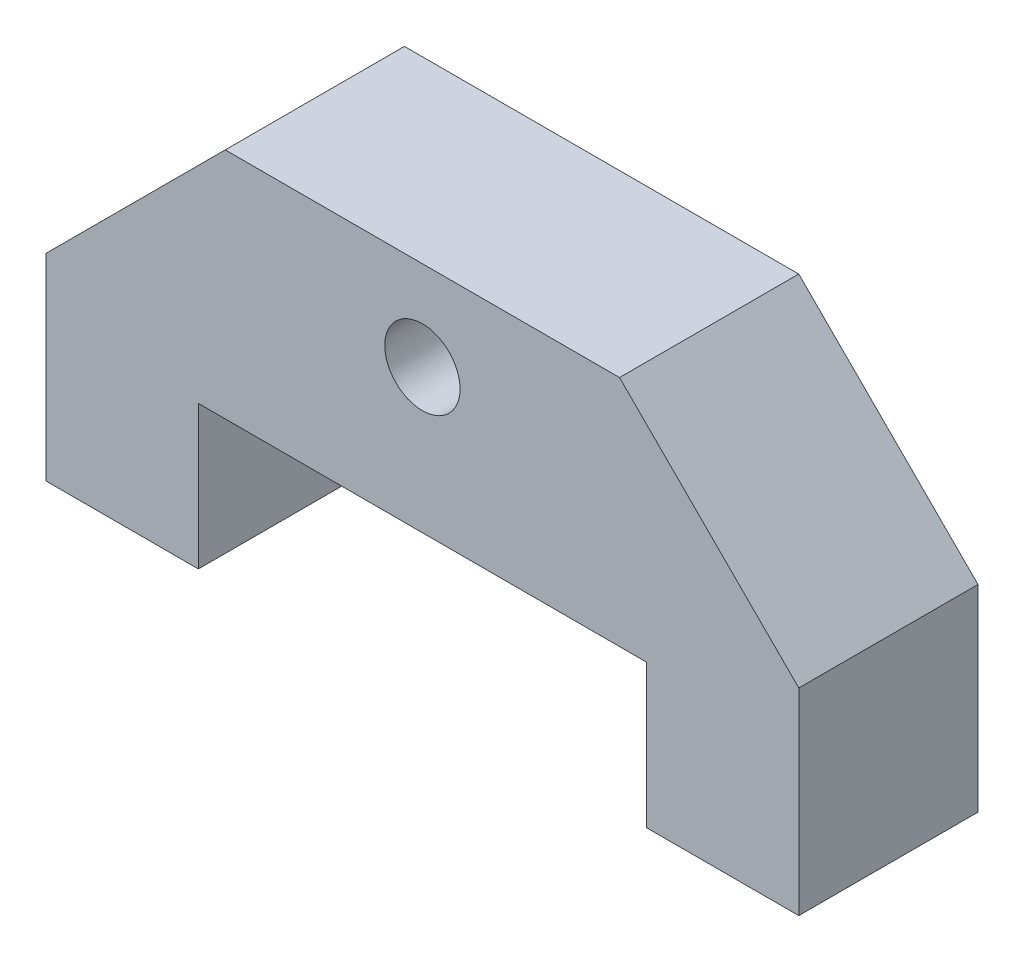
ISO-10303-21;
HEADER;
FILE_DESCRIPTION(('STEP AP214'),'2;1');
FILE_NAME('part.step','',(''),(''),'','','');
FILE_SCHEMA(('AUTOMOTIVE_DESIGN { 1 0 10303 214 1 1 1 1 }'));
ENDSEC;
DATA;
#1=APPLICATION_CONTEXT('core data for automotive mechanical design processes');
#2=APPLICATION_PROTOCOL_DEFINITION('international standard','automotive_design',2000,#1);
#3=PRODUCT_CONTEXT('',#1,'mechanical');
#4=PRODUCT('Part','Part','',(#3));
#5=PRODUCT_RELATED_PRODUCT_CATEGORY('part','',(#4));
#6=PRODUCT_DEFINITION_FORMATION('','',#4);
#7=PRODUCT_DEFINITION_CONTEXT('part definition',#1,'design');
#8=PRODUCT_DEFINITION('design','',#6,#7);
#9=PRODUCT_DEFINITION_SHAPE('','',#8);
#10=(LENGTH_UNIT() NAMED_UNIT(*) SI_UNIT(.MILLI.,.METRE.));
#11=(NAMED_UNIT(*) PLANE_ANGLE_UNIT() SI_UNIT($,.RADIAN.));
#12=(NAMED_UNIT(*) SI_UNIT($,.STERADIAN.) SOLID_ANGLE_UNIT());
#13=UNCERTAINTY_MEASURE_WITH_UNIT(LENGTH_MEASURE(1.E-05),#10,'distance_accuracy_value','');
#14=(GEOMETRIC_REPRESENTATION_CONTEXT(3) GLOBAL_UNCERTAINTY_ASSIGNED_CONTEXT((#13)) GLOBAL_UNIT_ASSIGNED_CONTEXT((#10,
#11,#12)) REPRESENTATION_CONTEXT('',''));
#15=CARTESIAN_POINT('',(0.,0.,0.));
#16=DIRECTION('',(0.,0.,1.));
#17=DIRECTION('',(1.,0.,0.));
#18=AXIS2_PLACEMENT_3D('',#15,#16,#17);
#19=CARTESIAN_POINT('',(-21.,-10.5,5.));
#20=DIRECTION('',(0.,1.,0.));
#21=DIRECTION('',(0.,0.,1.));
#22=AXIS2_PLACEMENT_3D('',#19,#20,#21);
#23=PLANE('',#22);
#24=CARTESIAN_POINT('',(16.,-10.5,0.));
#25=DIRECTION('',(0.,-1.,0.));
#26=DIRECTION('',(0.,0.,-1.));
#27=AXIS2_PLACEMENT_3D('',#24,#25,#26);
#28=CIRCLE('',#27,1.64999999999999);
#29=CARTESIAN_POINT('',(16.,-10.5,-1.64999999999999));
#30=VERTEX_POINT('',#29);
#31=EDGE_CURVE('E133',#30,#30,#28,.T.);
#32=ORIENTED_EDGE('',*,*,#31,.F.);
#33=EDGE_LOOP('',(#32));
#34=FACE_BOUND('',#33,.T.);
#35=DIRECTION('',(1.,0.,0.));
#36=VECTOR('',#35,1.);
#37=CARTESIAN_POINT('',(-21.,-10.5,5.));
#38=LINE('',#37,#36);
#39=CARTESIAN_POINT('',(12.5,-10.5,5.));
#40=VERTEX_POINT('',#39);
#41=CARTESIAN_POINT('',(21.,-10.5,5.));
#42=VERTEX_POINT('',#41);
#43=EDGE_CURVE('E180',#40,#42,#38,.T.);
#44=ORIENTED_EDGE('',*,*,#43,.F.);
#45=DIRECTION('',(0.,0.,1.));
#46=VECTOR('',#45,1.);
#47=CARTESIAN_POINT('',(12.5,-10.5,-5.));
#48=LINE('',#47,#46);
#49=CARTESIAN_POINT('',(12.5,-10.5,-5.));
#50=VERTEX_POINT('',#49);
#51=EDGE_CURVE('E164',#50,#40,#48,.T.);
#52=ORIENTED_EDGE('',*,*,#51,.F.);
#53=DIRECTION('',(1.,0.,0.));
#54=VECTOR('',#53,1.);
#55=CARTESIAN_POINT('',(-21.,-10.5,-5.));
#56=LINE('',#55,#54);
#57=CARTESIAN_POINT('',(21.,-10.5,-5.));
#58=VERTEX_POINT('',#57);
#59=EDGE_CURVE('E191',#50,#58,#56,.T.);
#60=ORIENTED_EDGE('',*,*,#59,.T.);
#61=DIRECTION('',(0.,0.,-1.));
#62=VECTOR('',#61,1.);
#63=CARTESIAN_POINT('',(21.,-10.5,5.));
#64=LINE('',#63,#62);
#65=EDGE_CURVE('E184',#42,#58,#64,.T.);
#66=ORIENTED_EDGE('',*,*,#65,.F.);
#67=EDGE_LOOP('',(#44,#52,#60,#66));
#68=FACE_BOUND('',#67,.T.);
#69=ADVANCED_FACE('F39',(#34,#68),#23,.F.);
#70=CARTESIAN_POINT('',(21.,-10.5,5.));
#71=DIRECTION('',(-1.,0.,0.));
#72=DIRECTION('',(0.,0.,1.));
#73=AXIS2_PLACEMENT_3D('',#70,#71,#72);
#74=PLANE('',#73);
#75=DIRECTION('',(0.,1.,0.));
#76=VECTOR('',#75,1.);
#77=CARTESIAN_POINT('',(21.,-10.5,-5.));
#78=LINE('',#77,#76);
#79=CARTESIAN_POINT('',(21.,0.499999999999966,-5.));
#80=VERTEX_POINT('',#79);
#81=EDGE_CURVE('E166',#58,#80,#78,.T.);
#82=ORIENTED_EDGE('',*,*,#81,.T.);
#83=DIRECTION('',(0.,0.,1.));
#84=VECTOR('',#83,1.);
#85=CARTESIAN_POINT('',(21.,0.499999999999969,5.));
#86=LINE('',#85,#84);
#87=CARTESIAN_POINT('',(21.,0.499999999999963,5.));
#88=VERTEX_POINT('',#87);
#89=EDGE_CURVE('E62',#80,#88,#86,.T.);
#90=ORIENTED_EDGE('',*,*,#89,.T.);
#91=DIRECTION('',(0.,1.,0.));
#92=VECTOR('',#91,1.);
#93=CARTESIAN_POINT('',(21.,-10.5,5.));
#94=LINE('',#93,#92);
#95=EDGE_CURVE('E173',#42,#88,#94,.T.);
#96=ORIENTED_EDGE('',*,*,#95,.F.);
#97=ORIENTED_EDGE('',*,*,#65,.T.);
#98=EDGE_LOOP('',(#82,#90,#96,#97));
#99=FACE_BOUND('',#98,.T.);
#100=ADVANCED_FACE('F223',(#99),#74,.F.);
#101=CARTESIAN_POINT('',(-21.,10.5,5.));
#102=DIRECTION('',(0.,-1.,0.));
#103=DIRECTION('',(0.,0.,-1.));
#104=AXIS2_PLACEMENT_3D('',#101,#102,#103);
#105=PLANE('',#104);
#106=DIRECTION('',(-1.,0.,0.));
#107=VECTOR('',#106,1.);
#108=CARTESIAN_POINT('',(-21.,10.5,5.));
#109=LINE('',#108,#107);
#110=CARTESIAN_POINT('',(11.,10.5,5.));
#111=VERTEX_POINT('',#110);
#112=CARTESIAN_POINT('',(-11.,10.5,5.));
#113=VERTEX_POINT('',#112);
#114=EDGE_CURVE('E175',#111,#113,#109,.T.);
#115=ORIENTED_EDGE('',*,*,#114,.F.);
#116=DIRECTION('',(0.,0.,-1.));
#117=VECTOR('',#116,1.);
#118=CARTESIAN_POINT('',(11.,10.5,5.));
#119=LINE('',#118,#117);
#120=CARTESIAN_POINT('',(11.,10.5,-5.));
#121=VERTEX_POINT('',#120);
#122=EDGE_CURVE('E201',#111,#121,#119,.T.);
#123=ORIENTED_EDGE('',*,*,#122,.T.);
#124=DIRECTION('',(-1.,0.,0.));
#125=VECTOR('',#124,1.);
#126=CARTESIAN_POINT('',(-21.,10.5,-5.));
#127=LINE('',#126,#125);
#128=CARTESIAN_POINT('',(-11.,10.5,-5.));
#129=VERTEX_POINT('',#128);
#130=EDGE_CURVE('E186',#121,#129,#127,.T.);
#131=ORIENTED_EDGE('',*,*,#130,.T.);
#132=DIRECTION('',(0.,0.,1.));
#133=VECTOR('',#132,1.);
#134=CARTESIAN_POINT('',(-11.,10.5,5.));
#135=LINE('',#134,#133);
#136=EDGE_CURVE('E199',#129,#113,#135,.T.);
#137=ORIENTED_EDGE('',*,*,#136,.T.);
#138=EDGE_LOOP('',(#115,#123,#131,#137));
#139=FACE_BOUND('',#138,.T.);
#140=ADVANCED_FACE('F215',(#139),#105,.F.);
#141=CARTESIAN_POINT('',(-21.,-10.5,5.));
#142=DIRECTION('',(1.,0.,0.));
#143=DIRECTION('',(0.,0.,-1.));
#144=AXIS2_PLACEMENT_3D('',#141,#142,#143);
#145=PLANE('',#144);
#146=DIRECTION('',(0.,-1.,0.));
#147=VECTOR('',#146,1.);
#148=CARTESIAN_POINT('',(-21.,-10.5,5.));
#149=LINE('',#148,#147);
#150=CARTESIAN_POINT('',(-21.,0.500000000000001,5.));
#151=VERTEX_POINT('',#150);
#152=CARTESIAN_POINT('',(-21.,-10.5,5.));
#153=VERTEX_POINT('',#152);
#154=EDGE_CURVE('E178',#151,#153,#149,.T.);
#155=ORIENTED_EDGE('',*,*,#154,.F.);
#156=DIRECTION('',(0.,0.,-1.));
#157=VECTOR('',#156,1.);
#158=CARTESIAN_POINT('',(-21.,0.500000000000004,5.));
#159=LINE('',#158,#157);
#160=CARTESIAN_POINT('',(-21.,0.500000000000004,-5.));
#161=VERTEX_POINT('',#160);
#162=EDGE_CURVE('E11',#151,#161,#159,.T.);
#163=ORIENTED_EDGE('',*,*,#162,.T.);
#164=DIRECTION('',(0.,-1.,0.));
#165=VECTOR('',#164,1.);
#166=CARTESIAN_POINT('',(-21.,-10.5,-5.));
#167=LINE('',#166,#165);
#168=CARTESIAN_POINT('',(-21.,-10.5,-5.));
#169=VERTEX_POINT('',#168);
#170=EDGE_CURVE('E189',#161,#169,#167,.T.);
#171=ORIENTED_EDGE('',*,*,#170,.T.);
#172=DIRECTION('',(0.,0.,-1.));
#173=VECTOR('',#172,1.);
#174=CARTESIAN_POINT('',(-21.,-10.5,5.));
#175=LINE('',#174,#173);
#176=EDGE_CURVE('E196',#153,#169,#175,.T.);
#177=ORIENTED_EDGE('',*,*,#176,.F.);
#178=EDGE_LOOP('',(#155,#163,#171,#177));
#179=FACE_BOUND('',#178,.T.);
#180=ADVANCED_FACE('F246',(#179),#145,.F.);
#181=CARTESIAN_POINT('',(-16.,-10.5,0.));
#182=DIRECTION('',(0.,-1.,0.));
#183=DIRECTION('',(0.,0.,-1.));
#184=AXIS2_PLACEMENT_3D('',#181,#182,#183);
#185=CIRCLE('',#184,1.64999999999999);
#186=CARTESIAN_POINT('',(-16.,-10.5,-1.64999999999999));
#187=VERTEX_POINT('',#186);
#188=EDGE_CURVE('E134',#187,#187,#185,.T.);
#189=ORIENTED_EDGE('',*,*,#188,.F.);
#190=EDGE_LOOP('',(#189));
#191=FACE_BOUND('',#190,.T.);
#192=CARTESIAN_POINT('',(-12.5,-10.5,-5.));
#193=VERTEX_POINT('',#192);
#194=EDGE_CURVE('E176',#169,#193,#56,.T.);
#195=ORIENTED_EDGE('',*,*,#194,.T.);
#196=DIRECTION('',(0.,0.,1.));
#197=VECTOR('',#196,1.);
#198=CARTESIAN_POINT('',(-12.5,-10.5,-5.));
#199=LINE('',#198,#197);
#200=CARTESIAN_POINT('',(-12.5,-10.5,5.));
#201=VERTEX_POINT('',#200);
#202=EDGE_CURVE('E167',#193,#201,#199,.T.);
#203=ORIENTED_EDGE('',*,*,#202,.T.);
#204=EDGE_CURVE('E181',#153,#201,#38,.T.);
#205=ORIENTED_EDGE('',*,*,#204,.F.);
#206=ORIENTED_EDGE('',*,*,#176,.T.);
#207=EDGE_LOOP('',(#195,#203,#205,#206));
#208=FACE_BOUND('',#207,.T.);
#209=ADVANCED_FACE('F242',(#191,#208),#23,.F.);
#210=CARTESIAN_POINT('',(0.,0.,5.));
#211=DIRECTION('',(0.,0.,-1.));
#212=DIRECTION('',(-1.,0.,0.));
#213=AXIS2_PLACEMENT_3D('',#210,#211,#212);
#214=PLANE('',#213);
#215=CARTESIAN_POINT('',(0.,5.5,5.));
#216=DIRECTION('',(0.,0.,1.));
#217=DIRECTION('',(1.,0.,0.));
#218=AXIS2_PLACEMENT_3D('',#215,#216,#217);
#219=CIRCLE('',#218,2.09999999999999);
#220=CARTESIAN_POINT('',(2.09999999999999,5.5,5.));
#221=VERTEX_POINT('',#220);
#222=EDGE_CURVE('E300',#221,#221,#219,.T.);
#223=ORIENTED_EDGE('',*,*,#222,.F.);
#224=EDGE_LOOP('',(#223));
#225=FACE_BOUND('',#224,.T.);
#226=ORIENTED_EDGE('',*,*,#95,.T.);
#227=DIRECTION('',(0.707106781186546,-0.707106781186549,0.));
#228=VECTOR('',#227,1.);
#229=CARTESIAN_POINT('',(11.,10.5,5.));
#230=LINE('',#229,#228);
#231=EDGE_CURVE('E47',#88,#111,#230,.F.);
#232=ORIENTED_EDGE('',*,*,#231,.T.);
#233=ORIENTED_EDGE('',*,*,#114,.T.);
#234=DIRECTION('',(0.707106781186549,0.707106781186546,0.));
#235=VECTOR('',#234,1.);
#236=CARTESIAN_POINT('',(-21.,0.500000000000004,5.));
#237=LINE('',#236,#235);
#238=EDGE_CURVE('E54',#113,#151,#237,.F.);
#239=ORIENTED_EDGE('',*,*,#238,.T.);
#240=ORIENTED_EDGE('',*,*,#154,.T.);
#241=ORIENTED_EDGE('',*,*,#204,.T.);
#242=DIRECTION('',(0.,-1.,0.));
#243=VECTOR('',#242,1.);
#244=CARTESIAN_POINT('',(-12.5,-2.5,5.));
#245=LINE('',#244,#243);
#246=CARTESIAN_POINT('',(-12.5,-2.5,5.));
#247=VERTEX_POINT('',#246);
#248=EDGE_CURVE('E151',#247,#201,#245,.T.);
#249=ORIENTED_EDGE('',*,*,#248,.F.);
#250=DIRECTION('',(-1.,0.,0.));
#251=VECTOR('',#250,1.);
#252=CARTESIAN_POINT('',(-12.5,-2.5,5.));
#253=LINE('',#252,#251);
#254=CARTESIAN_POINT('',(12.5,-2.5,5.));
#255=VERTEX_POINT('',#254);
#256=EDGE_CURVE('E160',#255,#247,#253,.T.);
#257=ORIENTED_EDGE('',*,*,#256,.F.);
#258=DIRECTION('',(0.,1.,0.));
#259=VECTOR('',#258,1.);
#260=CARTESIAN_POINT('',(12.5,-2.5,5.));
#261=LINE('',#260,#259);
#262=EDGE_CURVE('E146',#40,#255,#261,.T.);
#263=ORIENTED_EDGE('',*,*,#262,.F.);
#264=ORIENTED_EDGE('',*,*,#43,.T.);
#265=EDGE_LOOP('',(#226,#232,#233,#239,#240,#241,#249,#257,#263,#264));
#266=FACE_BOUND('',#265,.T.);
#267=ADVANCED_FACE('F211',(#225,#266),#214,.F.);
#268=CARTESIAN_POINT('',(0.,0.,-5.));
#269=DIRECTION('',(0.,0.,-1.));
#270=DIRECTION('',(-1.,0.,0.));
#271=AXIS2_PLACEMENT_3D('',#268,#269,#270);
#272=PLANE('',#271);
#273=CARTESIAN_POINT('',(0.,5.5,-5.));
#274=DIRECTION('',(0.,0.,1.));
#275=DIRECTION('',(1.,0.,0.));
#276=AXIS2_PLACEMENT_3D('',#273,#274,#275);
#277=CIRCLE('',#276,2.1);
#278=CARTESIAN_POINT('',(2.1,5.5,-5.));
#279=VERTEX_POINT('',#278);
#280=EDGE_CURVE('E140',#279,#279,#277,.T.);
#281=ORIENTED_EDGE('',*,*,#280,.T.);
#282=EDGE_LOOP('',(#281));
#283=FACE_BOUND('',#282,.T.);
#284=ORIENTED_EDGE('',*,*,#130,.F.);
#285=DIRECTION('',(-0.707106781186546,0.707106781186549,0.));
#286=VECTOR('',#285,1.);
#287=CARTESIAN_POINT('',(10.75,10.75,-5.));
#288=LINE('',#287,#286);
#289=EDGE_CURVE('E206',#121,#80,#288,.F.);
#290=ORIENTED_EDGE('',*,*,#289,.T.);
#291=ORIENTED_EDGE('',*,*,#81,.F.);
#292=ORIENTED_EDGE('',*,*,#59,.F.);
#293=DIRECTION('',(0.,1.,0.));
#294=VECTOR('',#293,1.);
#295=CARTESIAN_POINT('',(12.5,-2.5,-5.));
#296=LINE('',#295,#294);
#297=CARTESIAN_POINT('',(12.5,-2.5,-5.));
#298=VERTEX_POINT('',#297);
#299=EDGE_CURVE('E147',#50,#298,#296,.T.);
#300=ORIENTED_EDGE('',*,*,#299,.T.);
#301=DIRECTION('',(-1.,0.,0.));
#302=VECTOR('',#301,1.);
#303=CARTESIAN_POINT('',(-12.5,-2.5,-5.));
#304=LINE('',#303,#302);
#305=CARTESIAN_POINT('',(-12.5,-2.5,-5.));
#306=VERTEX_POINT('',#305);
#307=EDGE_CURVE('E150',#298,#306,#304,.T.);
#308=ORIENTED_EDGE('',*,*,#307,.T.);
#309=DIRECTION('',(0.,-1.,0.));
#310=VECTOR('',#309,1.);
#311=CARTESIAN_POINT('',(-12.5,-2.5,-5.));
#312=LINE('',#311,#310);
#313=EDGE_CURVE('E154',#306,#193,#312,.T.);
#314=ORIENTED_EDGE('',*,*,#313,.T.);
#315=ORIENTED_EDGE('',*,*,#194,.F.);
#316=ORIENTED_EDGE('',*,*,#170,.F.);
#317=DIRECTION('',(-0.707106781186549,-0.707106781186546,0.));
#318=VECTOR('',#317,1.);
#319=CARTESIAN_POINT('',(-10.75,10.75,-5.));
#320=LINE('',#319,#318);
#321=EDGE_CURVE('E204',#161,#129,#320,.F.);
#322=ORIENTED_EDGE('',*,*,#321,.T.);
#323=EDGE_LOOP('',(#284,#290,#291,#292,#300,#308,#314,#315,#316,#322));
#324=FACE_BOUND('',#323,.T.);
#325=ADVANCED_FACE('F221',(#283,#324),#272,.T.);
#326=CARTESIAN_POINT('',(12.5,-2.5,-5.));
#327=DIRECTION('',(1.,0.,0.));
#328=DIRECTION('',(0.,1.,0.));
#329=AXIS2_PLACEMENT_3D('',#326,#327,#328);
#330=PLANE('',#329);
#331=ORIENTED_EDGE('',*,*,#262,.T.);
#332=DIRECTION('',(0.,0.,1.));
#333=VECTOR('',#332,1.);
#334=CARTESIAN_POINT('',(12.5,-2.5,-5.));
#335=LINE('',#334,#333);
#336=EDGE_CURVE('E157',#298,#255,#335,.T.);
#337=ORIENTED_EDGE('',*,*,#336,.F.);
#338=ORIENTED_EDGE('',*,*,#299,.F.);
#339=ORIENTED_EDGE('',*,*,#51,.T.);
#340=EDGE_LOOP('',(#331,#337,#338,#339));
#341=FACE_BOUND('',#340,.T.);
#342=ADVANCED_FACE('F230',(#341),#330,.F.);
#343=CARTESIAN_POINT('',(-12.5,-2.5,-5.));
#344=DIRECTION('',(-1.,0.,0.));
#345=DIRECTION('',(0.,-1.,0.));
#346=AXIS2_PLACEMENT_3D('',#343,#344,#345);
#347=PLANE('',#346);
#348=ORIENTED_EDGE('',*,*,#248,.T.);
#349=ORIENTED_EDGE('',*,*,#202,.F.);
#350=ORIENTED_EDGE('',*,*,#313,.F.);
#351=DIRECTION('',(0.,0.,1.));
#352=VECTOR('',#351,1.);
#353=CARTESIAN_POINT('',(-12.5,-2.5,-5.));
#354=LINE('',#353,#352);
#355=EDGE_CURVE('E170',#306,#247,#354,.T.);
#356=ORIENTED_EDGE('',*,*,#355,.T.);
#357=EDGE_LOOP('',(#348,#349,#350,#356));
#358=FACE_BOUND('',#357,.T.);
#359=ADVANCED_FACE('F238',(#358),#347,.F.);
#360=CARTESIAN_POINT('',(-12.5,-2.5,-5.));
#361=DIRECTION('',(0.,1.,0.));
#362=DIRECTION('',(0.,0.,1.));
#363=AXIS2_PLACEMENT_3D('',#360,#361,#362);
#364=PLANE('',#363);
#365=ORIENTED_EDGE('',*,*,#256,.T.);
#366=ORIENTED_EDGE('',*,*,#355,.F.);
#367=ORIENTED_EDGE('',*,*,#307,.F.);
#368=ORIENTED_EDGE('',*,*,#336,.T.);
#369=EDGE_LOOP('',(#365,#366,#367,#368));
#370=FACE_BOUND('',#369,.T.);
#371=ADVANCED_FACE('F235',(#370),#364,.F.);
#372=CARTESIAN_POINT('',(16.,-0.400000000000005,0.));
#373=DIRECTION('',(0.,-1.,0.));
#374=DIRECTION('',(0.,0.,-1.));
#375=AXIS2_PLACEMENT_3D('',#372,#373,#374);
#376=CONICAL_SURFACE('',#375,1.64999999999999,1.02974425867665);
#377=CARTESIAN_POINT('',(16.,0.591420021395473,0.));
#378=VERTEX_POINT('',#377);
#379=VERTEX_LOOP('',#378);
#380=FACE_BOUND('',#379,.T.);
#381=CARTESIAN_POINT('',(16.,-0.400000000000005,0.));
#382=DIRECTION('',(0.,-1.,0.));
#383=DIRECTION('',(0.,0.,-1.));
#384=AXIS2_PLACEMENT_3D('',#381,#382,#383);
#385=CIRCLE('',#384,1.64999999999999);
#386=CARTESIAN_POINT('',(16.,-0.400000000000005,-1.64999999999998));
#387=VERTEX_POINT('',#386);
#388=EDGE_CURVE('E137',#387,#387,#385,.T.);
#389=ORIENTED_EDGE('',*,*,#388,.T.);
#390=EDGE_LOOP('',(#389));
#391=FACE_BOUND('',#390,.T.);
#392=ADVANCED_FACE('F284',(#380,#391),#376,.F.);
#393=CARTESIAN_POINT('',(16.,-10.5,0.));
#394=DIRECTION('',(0.,-1.,0.));
#395=DIRECTION('',(0.,0.,-1.));
#396=AXIS2_PLACEMENT_3D('',#393,#394,#395);
#397=CYLINDRICAL_SURFACE('',#396,1.64999999999999);
#398=ORIENTED_EDGE('',*,*,#388,.F.);
#399=EDGE_LOOP('',(#398));
#400=FACE_BOUND('',#399,.T.);
#401=ORIENTED_EDGE('',*,*,#31,.T.);
#402=EDGE_LOOP('',(#401));
#403=FACE_BOUND('',#402,.T.);
#404=ADVANCED_FACE('F127',(#400,#403),#397,.F.);
#405=CARTESIAN_POINT('',(-16.,-0.400000000000005,0.));
#406=DIRECTION('',(0.,-1.,0.));
#407=DIRECTION('',(0.,0.,-1.));
#408=AXIS2_PLACEMENT_3D('',#405,#406,#407);
#409=CONICAL_SURFACE('',#408,1.64999999999999,1.02974425867665);
#410=CARTESIAN_POINT('',(-16.,0.591420021395473,0.));
#411=VERTEX_POINT('',#410);
#412=VERTEX_LOOP('',#411);
#413=FACE_BOUND('',#412,.T.);
#414=CARTESIAN_POINT('',(-16.,-0.400000000000005,0.));
#415=DIRECTION('',(0.,-1.,0.));
#416=DIRECTION('',(0.,0.,-1.));
#417=AXIS2_PLACEMENT_3D('',#414,#415,#416);
#418=CIRCLE('',#417,1.64999999999999);
#419=CARTESIAN_POINT('',(-16.,-0.400000000000005,-1.64999999999999));
#420=VERTEX_POINT('',#419);
#421=EDGE_CURVE('E131',#420,#420,#418,.T.);
#422=ORIENTED_EDGE('',*,*,#421,.T.);
#423=EDGE_LOOP('',(#422));
#424=FACE_BOUND('',#423,.T.);
#425=ADVANCED_FACE('F123',(#413,#424),#409,.F.);
#426=CARTESIAN_POINT('',(-16.,-10.5,0.));
#427=DIRECTION('',(0.,-1.,0.));
#428=DIRECTION('',(0.,0.,-1.));
#429=AXIS2_PLACEMENT_3D('',#426,#427,#428);
#430=CYLINDRICAL_SURFACE('',#429,1.64999999999999);
#431=ORIENTED_EDGE('',*,*,#421,.F.);
#432=EDGE_LOOP('',(#431));
#433=FACE_BOUND('',#432,.T.);
#434=ORIENTED_EDGE('',*,*,#188,.T.);
#435=EDGE_LOOP('',(#434));
#436=FACE_BOUND('',#435,.T.);
#437=ADVANCED_FACE('F126',(#433,#436),#430,.F.);
#438=CARTESIAN_POINT('',(0.,5.5,5.));
#439=DIRECTION('',(0.,0.,1.));
#440=DIRECTION('',(1.,0.,0.));
#441=AXIS2_PLACEMENT_3D('',#438,#439,#440);
#442=CYLINDRICAL_SURFACE('',#441,2.09999999999999);
#443=ORIENTED_EDGE('',*,*,#280,.F.);
#444=EDGE_LOOP('',(#443));
#445=FACE_BOUND('',#444,.T.);
#446=ORIENTED_EDGE('',*,*,#222,.T.);
#447=EDGE_LOOP('',(#446));
#448=FACE_BOUND('',#447,.T.);
#449=ADVANCED_FACE('F253',(#445,#448),#442,.F.);
#450=CARTESIAN_POINT('',(11.,10.5,5.));
#451=DIRECTION('',(-0.707106781186549,-0.707106781186546,0.));
#452=DIRECTION('',(0.,0.,-1.));
#453=AXIS2_PLACEMENT_3D('',#450,#451,#452);
#454=PLANE('',#453);
#455=ORIENTED_EDGE('',*,*,#231,.F.);
#456=ORIENTED_EDGE('',*,*,#89,.F.);
#457=ORIENTED_EDGE('',*,*,#289,.F.);
#458=ORIENTED_EDGE('',*,*,#122,.F.);
#459=EDGE_LOOP('',(#455,#456,#457,#458));
#460=FACE_BOUND('',#459,.T.);
#461=ADVANCED_FACE('F218',(#460),#454,.F.);
#462=CARTESIAN_POINT('',(-21.,0.500000000000004,5.));
#463=DIRECTION('',(0.707106781186546,-0.707106781186549,0.));
#464=DIRECTION('',(0.,0.,-1.));
#465=AXIS2_PLACEMENT_3D('',#462,#463,#464);
#466=PLANE('',#465);
#467=ORIENTED_EDGE('',*,*,#238,.F.);
#468=ORIENTED_EDGE('',*,*,#136,.F.);
#469=ORIENTED_EDGE('',*,*,#321,.F.);
#470=ORIENTED_EDGE('',*,*,#162,.F.);
#471=EDGE_LOOP('',(#467,#468,#469,#470));
#472=FACE_BOUND('',#471,.T.);
#473=ADVANCED_FACE('F41',(#472),#466,.F.);
#474=CLOSED_SHELL('',(#69,#100,#140,#180,#209,#267,#325,#342,#359,#371,#392,#404,#425,#437,#449,
#461,#473));
#475=MANIFOLD_SOLID_BREP('B2',#474);
#476=ADVANCED_BREP_SHAPE_REPRESENTATION('',(#18,#475),#14);
#477=SHAPE_DEFINITION_REPRESENTATION(#9,#476);
ENDSEC;
END-ISO-10303-21;
